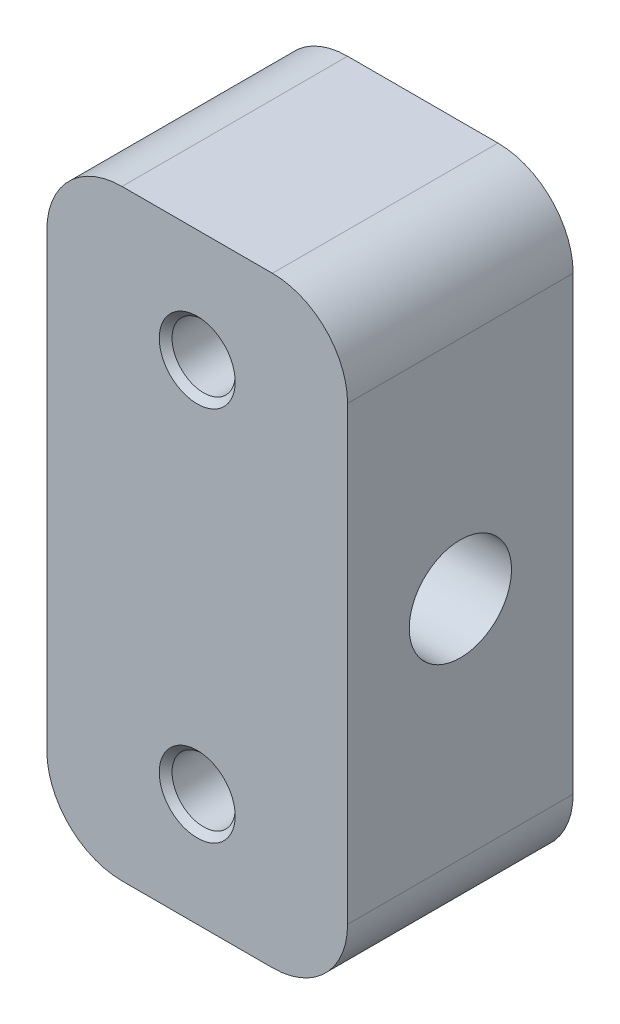
ISO-10303-21;
HEADER;
FILE_DESCRIPTION(('STEP AP214'),'2;1');
FILE_NAME('part.step','',(''),(''),'','','');
FILE_SCHEMA(('AUTOMOTIVE_DESIGN { 1 0 10303 214 1 1 1 1 }'));
ENDSEC;
DATA;
#1=APPLICATION_CONTEXT('core data for automotive mechanical design processes');
#2=APPLICATION_PROTOCOL_DEFINITION('international standard','automotive_design',2000,#1);
#3=PRODUCT_CONTEXT('',#1,'mechanical');
#4=PRODUCT('Part','Part','',(#3));
#5=PRODUCT_RELATED_PRODUCT_CATEGORY('part','',(#4));
#6=PRODUCT_DEFINITION_FORMATION('','',#4);
#7=PRODUCT_DEFINITION_CONTEXT('part definition',#1,'design');
#8=PRODUCT_DEFINITION('design','',#6,#7);
#9=PRODUCT_DEFINITION_SHAPE('','',#8);
#10=(LENGTH_UNIT() NAMED_UNIT(*) SI_UNIT(.MILLI.,.METRE.));
#11=(NAMED_UNIT(*) PLANE_ANGLE_UNIT() SI_UNIT($,.RADIAN.));
#12=(NAMED_UNIT(*) SI_UNIT($,.STERADIAN.) SOLID_ANGLE_UNIT());
#13=UNCERTAINTY_MEASURE_WITH_UNIT(LENGTH_MEASURE(1.E-05),#10,'distance_accuracy_value','');
#14=(GEOMETRIC_REPRESENTATION_CONTEXT(3) GLOBAL_UNCERTAINTY_ASSIGNED_CONTEXT((#13)) GLOBAL_UNIT_ASSIGNED_CONTEXT((#10,
#11,#12)) REPRESENTATION_CONTEXT('',''));
#15=CARTESIAN_POINT('',(0.,0.,0.));
#16=DIRECTION('',(0.,0.,1.));
#17=DIRECTION('',(1.,0.,0.));
#18=AXIS2_PLACEMENT_3D('',#15,#16,#17);
#19=CARTESIAN_POINT('',(10.,-20.,7.5));
#20=DIRECTION('',(-1.,0.,0.));
#21=DIRECTION('',(0.,0.,1.));
#22=AXIS2_PLACEMENT_3D('',#19,#20,#21);
#23=PLANE('',#22);
#24=CARTESIAN_POINT('',(10.,0.,0.));
#25=DIRECTION('',(-1.,0.,0.));
#26=DIRECTION('',(0.,0.,1.));
#27=AXIS2_PLACEMENT_3D('',#24,#25,#26);
#28=CIRCLE('',#27,3.4);
#29=CARTESIAN_POINT('',(10.,0.,3.4));
#30=VERTEX_POINT('',#29);
#31=EDGE_CURVE('E193',#30,#30,#28,.F.);
#32=ORIENTED_EDGE('',*,*,#31,.F.);
#33=EDGE_LOOP('',(#32));
#34=FACE_BOUND('',#33,.T.);
#35=DIRECTION('',(0.,1.,0.));
#36=VECTOR('',#35,1.);
#37=CARTESIAN_POINT('',(10.,-20.,7.5));
#38=LINE('',#37,#36);
#39=CARTESIAN_POINT('',(10.,-15.,7.5));
#40=VERTEX_POINT('',#39);
#41=CARTESIAN_POINT('',(10.,15.,7.5));
#42=VERTEX_POINT('',#41);
#43=EDGE_CURVE('E133',#40,#42,#38,.T.);
#44=ORIENTED_EDGE('',*,*,#43,.F.);
#45=DIRECTION('',(0.,0.,-1.));
#46=VECTOR('',#45,1.);
#47=CARTESIAN_POINT('',(10.,-15.,7.5));
#48=LINE('',#47,#46);
#49=CARTESIAN_POINT('',(10.,-15.,-7.5));
#50=VERTEX_POINT('',#49);
#51=EDGE_CURVE('E159',#40,#50,#48,.T.);
#52=ORIENTED_EDGE('',*,*,#51,.T.);
#53=DIRECTION('',(0.,1.,0.));
#54=VECTOR('',#53,1.);
#55=CARTESIAN_POINT('',(10.,-20.,-7.5));
#56=LINE('',#55,#54);
#57=CARTESIAN_POINT('',(10.,15.,-7.5));
#58=VERTEX_POINT('',#57);
#59=EDGE_CURVE('E167',#50,#58,#56,.T.);
#60=ORIENTED_EDGE('',*,*,#59,.T.);
#61=DIRECTION('',(0.,0.,-1.));
#62=VECTOR('',#61,1.);
#63=CARTESIAN_POINT('',(10.,15.,7.5));
#64=LINE('',#63,#62);
#65=EDGE_CURVE('E157',#58,#42,#64,.F.);
#66=ORIENTED_EDGE('',*,*,#65,.T.);
#67=EDGE_LOOP('',(#44,#52,#60,#66));
#68=FACE_BOUND('',#67,.T.);
#69=ADVANCED_FACE('F42',(#34,#68),#23,.F.);
#70=CARTESIAN_POINT('',(-10.,20.,7.5));
#71=DIRECTION('',(0.,-1.,0.));
#72=DIRECTION('',(0.,0.,-1.));
#73=AXIS2_PLACEMENT_3D('',#70,#71,#72);
#74=PLANE('',#73);
#75=DIRECTION('',(-1.,0.,0.));
#76=VECTOR('',#75,1.);
#77=CARTESIAN_POINT('',(-10.,20.,-7.5));
#78=LINE('',#77,#76);
#79=CARTESIAN_POINT('',(5.,20.,-7.5));
#80=VERTEX_POINT('',#79);
#81=CARTESIAN_POINT('',(-5.,20.,-7.5));
#82=VERTEX_POINT('',#81);
#83=EDGE_CURVE('E138',#80,#82,#78,.T.);
#84=ORIENTED_EDGE('',*,*,#83,.T.);
#85=DIRECTION('',(0.,0.,-1.));
#86=VECTOR('',#85,1.);
#87=CARTESIAN_POINT('',(-5.,20.,7.5));
#88=LINE('',#87,#86);
#89=CARTESIAN_POINT('',(-5.,20.,7.5));
#90=VERTEX_POINT('',#89);
#91=EDGE_CURVE('E11',#82,#90,#88,.F.);
#92=ORIENTED_EDGE('',*,*,#91,.T.);
#93=DIRECTION('',(-1.,0.,0.));
#94=VECTOR('',#93,1.);
#95=CARTESIAN_POINT('',(-10.,20.,7.5));
#96=LINE('',#95,#94);
#97=CARTESIAN_POINT('',(5.,20.,7.5));
#98=VERTEX_POINT('',#97);
#99=EDGE_CURVE('E136',#98,#90,#96,.T.);
#100=ORIENTED_EDGE('',*,*,#99,.F.);
#101=DIRECTION('',(0.,0.,-1.));
#102=VECTOR('',#101,1.);
#103=CARTESIAN_POINT('',(5.,20.,7.5));
#104=LINE('',#103,#102);
#105=EDGE_CURVE('E50',#98,#80,#104,.T.);
#106=ORIENTED_EDGE('',*,*,#105,.T.);
#107=EDGE_LOOP('',(#84,#92,#100,#106));
#108=FACE_BOUND('',#107,.T.);
#109=ADVANCED_FACE('F164',(#108),#74,.F.);
#110=CARTESIAN_POINT('',(-10.,-20.,7.5));
#111=DIRECTION('',(1.,0.,0.));
#112=DIRECTION('',(0.,0.,-1.));
#113=AXIS2_PLACEMENT_3D('',#110,#111,#112);
#114=PLANE('',#113);
#115=CARTESIAN_POINT('',(-10.,0.,0.));
#116=DIRECTION('',(-1.,0.,0.));
#117=DIRECTION('',(0.,0.,1.));
#118=AXIS2_PLACEMENT_3D('',#115,#116,#117);
#119=CIRCLE('',#118,4.025);
#120=CARTESIAN_POINT('',(-10.,0.,4.025));
#121=VERTEX_POINT('',#120);
#122=EDGE_CURVE('E197',#121,#121,#119,.T.);
#123=ORIENTED_EDGE('',*,*,#122,.F.);
#124=EDGE_LOOP('',(#123));
#125=FACE_BOUND('',#124,.T.);
#126=DIRECTION('',(0.,-1.,0.));
#127=VECTOR('',#126,1.);
#128=CARTESIAN_POINT('',(-10.,-20.,-7.5));
#129=LINE('',#128,#127);
#130=CARTESIAN_POINT('',(-10.,15.,-7.5));
#131=VERTEX_POINT('',#130);
#132=CARTESIAN_POINT('',(-10.,-15.,-7.5));
#133=VERTEX_POINT('',#132);
#134=EDGE_CURVE('E134',#131,#133,#129,.T.);
#135=ORIENTED_EDGE('',*,*,#134,.T.);
#136=DIRECTION('',(0.,0.,-1.));
#137=VECTOR('',#136,1.);
#138=CARTESIAN_POINT('',(-10.,-15.,7.5));
#139=LINE('',#138,#137);
#140=CARTESIAN_POINT('',(-10.,-15.,7.5));
#141=VERTEX_POINT('',#140);
#142=EDGE_CURVE('E112',#133,#141,#139,.F.);
#143=ORIENTED_EDGE('',*,*,#142,.T.);
#144=DIRECTION('',(0.,-1.,0.));
#145=VECTOR('',#144,1.);
#146=CARTESIAN_POINT('',(-10.,-20.,7.5));
#147=LINE('',#146,#145);
#148=CARTESIAN_POINT('',(-10.,15.,7.5));
#149=VERTEX_POINT('',#148);
#150=EDGE_CURVE('E172',#149,#141,#147,.T.);
#151=ORIENTED_EDGE('',*,*,#150,.F.);
#152=DIRECTION('',(0.,0.,-1.));
#153=VECTOR('',#152,1.);
#154=CARTESIAN_POINT('',(-10.,15.,7.5));
#155=LINE('',#154,#153);
#156=EDGE_CURVE('E117',#149,#131,#155,.T.);
#157=ORIENTED_EDGE('',*,*,#156,.T.);
#158=EDGE_LOOP('',(#135,#143,#151,#157));
#159=FACE_BOUND('',#158,.T.);
#160=ADVANCED_FACE('F220',(#125,#159),#114,.F.);
#161=CARTESIAN_POINT('',(-10.,-20.,7.5));
#162=DIRECTION('',(0.,1.,0.));
#163=DIRECTION('',(0.,0.,1.));
#164=AXIS2_PLACEMENT_3D('',#161,#162,#163);
#165=PLANE('',#164);
#166=DIRECTION('',(1.,0.,0.));
#167=VECTOR('',#166,1.);
#168=CARTESIAN_POINT('',(-10.,-20.,7.5));
#169=LINE('',#168,#167);
#170=CARTESIAN_POINT('',(-5.,-20.,7.5));
#171=VERTEX_POINT('',#170);
#172=CARTESIAN_POINT('',(5.,-20.,7.5));
#173=VERTEX_POINT('',#172);
#174=EDGE_CURVE('E127',#171,#173,#169,.T.);
#175=ORIENTED_EDGE('',*,*,#174,.F.);
#176=DIRECTION('',(0.,0.,-1.));
#177=VECTOR('',#176,1.);
#178=CARTESIAN_POINT('',(-5.,-20.,7.5));
#179=LINE('',#178,#177);
#180=CARTESIAN_POINT('',(-5.,-20.,-7.5));
#181=VERTEX_POINT('',#180);
#182=EDGE_CURVE('E111',#171,#181,#179,.T.);
#183=ORIENTED_EDGE('',*,*,#182,.T.);
#184=DIRECTION('',(1.,0.,0.));
#185=VECTOR('',#184,1.);
#186=CARTESIAN_POINT('',(-10.,-20.,-7.5));
#187=LINE('',#186,#185);
#188=CARTESIAN_POINT('',(5.,-20.,-7.5));
#189=VERTEX_POINT('',#188);
#190=EDGE_CURVE('E124',#181,#189,#187,.T.);
#191=ORIENTED_EDGE('',*,*,#190,.T.);
#192=DIRECTION('',(0.,0.,-1.));
#193=VECTOR('',#192,1.);
#194=CARTESIAN_POINT('',(5.,-20.,7.5));
#195=LINE('',#194,#193);
#196=EDGE_CURVE('E129',#189,#173,#195,.F.);
#197=ORIENTED_EDGE('',*,*,#196,.T.);
#198=EDGE_LOOP('',(#175,#183,#191,#197));
#199=FACE_BOUND('',#198,.T.);
#200=ADVANCED_FACE('F123',(#199),#165,.F.);
#201=CARTESIAN_POINT('',(0.,0.,7.5));
#202=DIRECTION('',(0.,0.,-1.));
#203=DIRECTION('',(-1.,0.,0.));
#204=AXIS2_PLACEMENT_3D('',#201,#202,#203);
#205=PLANE('',#204);
#206=CARTESIAN_POINT('',(0.,12.5,7.5));
#207=DIRECTION('',(0.,0.,1.));
#208=DIRECTION('',(1.,0.,0.));
#209=AXIS2_PLACEMENT_3D('',#206,#207,#208);
#210=CIRCLE('',#209,2.525);
#211=CARTESIAN_POINT('',(2.525,12.5,7.5));
#212=VERTEX_POINT('',#211);
#213=EDGE_CURVE('E190',#212,#212,#210,.T.);
#214=ORIENTED_EDGE('',*,*,#213,.F.);
#215=EDGE_LOOP('',(#214));
#216=FACE_BOUND('',#215,.T.);
#217=CARTESIAN_POINT('',(0.,-12.5,7.5));
#218=DIRECTION('',(0.,0.,1.));
#219=DIRECTION('',(1.,0.,0.));
#220=AXIS2_PLACEMENT_3D('',#217,#218,#219);
#221=CIRCLE('',#220,2.525);
#222=CARTESIAN_POINT('',(2.525,-12.5,7.5));
#223=VERTEX_POINT('',#222);
#224=EDGE_CURVE('E181',#223,#223,#221,.T.);
#225=ORIENTED_EDGE('',*,*,#224,.F.);
#226=EDGE_LOOP('',(#225));
#227=FACE_BOUND('',#226,.T.);
#228=ORIENTED_EDGE('',*,*,#150,.T.);
#229=CARTESIAN_POINT('',(-5.,-15.,7.5));
#230=DIRECTION('',(0.,0.,-1.));
#231=DIRECTION('',(-1.,0.,0.));
#232=AXIS2_PLACEMENT_3D('',#229,#230,#231);
#233=CIRCLE('',#232,5.);
#234=EDGE_CURVE('E155',#141,#171,#233,.F.);
#235=ORIENTED_EDGE('',*,*,#234,.T.);
#236=ORIENTED_EDGE('',*,*,#174,.T.);
#237=CARTESIAN_POINT('',(5.,-15.,7.5));
#238=DIRECTION('',(0.,0.,-1.));
#239=DIRECTION('',(-1.,0.,0.));
#240=AXIS2_PLACEMENT_3D('',#237,#238,#239);
#241=CIRCLE('',#240,5.);
#242=EDGE_CURVE('E153',#173,#40,#241,.F.);
#243=ORIENTED_EDGE('',*,*,#242,.T.);
#244=ORIENTED_EDGE('',*,*,#43,.T.);
#245=CARTESIAN_POINT('',(5.,15.,7.5));
#246=DIRECTION('',(0.,0.,-1.));
#247=DIRECTION('',(-1.,0.,0.));
#248=AXIS2_PLACEMENT_3D('',#245,#246,#247);
#249=CIRCLE('',#248,5.);
#250=EDGE_CURVE('E62',#42,#98,#249,.F.);
#251=ORIENTED_EDGE('',*,*,#250,.T.);
#252=ORIENTED_EDGE('',*,*,#99,.T.);
#253=CARTESIAN_POINT('',(-5.,15.,7.5));
#254=DIRECTION('',(0.,0.,-1.));
#255=DIRECTION('',(-1.,0.,0.));
#256=AXIS2_PLACEMENT_3D('',#253,#254,#255);
#257=CIRCLE('',#256,5.);
#258=EDGE_CURVE('E151',#90,#149,#257,.F.);
#259=ORIENTED_EDGE('',*,*,#258,.T.);
#260=EDGE_LOOP('',(#228,#235,#236,#243,#244,#251,#252,#259));
#261=FACE_BOUND('',#260,.T.);
#262=ADVANCED_FACE('F215',(#216,#227,#261),#205,.F.);
#263=CARTESIAN_POINT('',(0.,0.,-7.5));
#264=DIRECTION('',(0.,0.,-1.));
#265=DIRECTION('',(-1.,0.,0.));
#266=AXIS2_PLACEMENT_3D('',#263,#264,#265);
#267=PLANE('',#266);
#268=CARTESIAN_POINT('',(0.,12.5,-7.50000000000001));
#269=DIRECTION('',(0.,0.,1.));
#270=DIRECTION('',(1.,0.,0.));
#271=AXIS2_PLACEMENT_3D('',#268,#269,#270);
#272=CIRCLE('',#271,2.09999999999997);
#273=CARTESIAN_POINT('',(2.09999999999997,12.5,-7.50000000000001));
#274=VERTEX_POINT('',#273);
#275=EDGE_CURVE('E184',#274,#274,#272,.T.);
#276=ORIENTED_EDGE('',*,*,#275,.T.);
#277=EDGE_LOOP('',(#276));
#278=FACE_BOUND('',#277,.T.);
#279=CARTESIAN_POINT('',(0.,-12.5,-7.50000000000001));
#280=DIRECTION('',(0.,0.,1.));
#281=DIRECTION('',(1.,0.,0.));
#282=AXIS2_PLACEMENT_3D('',#279,#280,#281);
#283=CIRCLE('',#282,2.09999999999997);
#284=CARTESIAN_POINT('',(2.09999999999997,-12.5,-7.50000000000001));
#285=VERTEX_POINT('',#284);
#286=EDGE_CURVE('E168',#285,#285,#283,.T.);
#287=ORIENTED_EDGE('',*,*,#286,.T.);
#288=EDGE_LOOP('',(#287));
#289=FACE_BOUND('',#288,.T.);
#290=ORIENTED_EDGE('',*,*,#190,.F.);
#291=CARTESIAN_POINT('',(-5.,-15.,-7.5));
#292=DIRECTION('',(0.,0.,-1.));
#293=DIRECTION('',(-1.,0.,0.));
#294=AXIS2_PLACEMENT_3D('',#291,#292,#293);
#295=CIRCLE('',#294,5.);
#296=EDGE_CURVE('E107',#181,#133,#295,.T.);
#297=ORIENTED_EDGE('',*,*,#296,.T.);
#298=ORIENTED_EDGE('',*,*,#134,.F.);
#299=CARTESIAN_POINT('',(-5.,15.,-7.5));
#300=DIRECTION('',(0.,0.,-1.));
#301=DIRECTION('',(-1.,0.,0.));
#302=AXIS2_PLACEMENT_3D('',#299,#300,#301);
#303=CIRCLE('',#302,5.);
#304=EDGE_CURVE('E144',#131,#82,#303,.T.);
#305=ORIENTED_EDGE('',*,*,#304,.T.);
#306=ORIENTED_EDGE('',*,*,#83,.F.);
#307=CARTESIAN_POINT('',(5.,15.,-7.5));
#308=DIRECTION('',(0.,0.,-1.));
#309=DIRECTION('',(-1.,0.,0.));
#310=AXIS2_PLACEMENT_3D('',#307,#308,#309);
#311=CIRCLE('',#310,5.);
#312=EDGE_CURVE('E128',#80,#58,#311,.T.);
#313=ORIENTED_EDGE('',*,*,#312,.T.);
#314=ORIENTED_EDGE('',*,*,#59,.F.);
#315=CARTESIAN_POINT('',(5.,-15.,-7.5));
#316=DIRECTION('',(0.,0.,-1.));
#317=DIRECTION('',(-1.,0.,0.));
#318=AXIS2_PLACEMENT_3D('',#315,#316,#317);
#319=CIRCLE('',#318,5.);
#320=EDGE_CURVE('E118',#50,#189,#319,.T.);
#321=ORIENTED_EDGE('',*,*,#320,.T.);
#322=EDGE_LOOP('',(#290,#297,#298,#305,#306,#313,#314,#321));
#323=FACE_BOUND('',#322,.T.);
#324=ADVANCED_FACE('F131',(#278,#289,#323),#267,.T.);
#325=CARTESIAN_POINT('',(-5.,-15.,7.5));
#326=DIRECTION('',(0.,0.,-1.));
#327=DIRECTION('',(-1.,0.,0.));
#328=AXIS2_PLACEMENT_3D('',#325,#326,#327);
#329=CYLINDRICAL_SURFACE('',#328,5.);
#330=ORIENTED_EDGE('',*,*,#234,.F.);
#331=ORIENTED_EDGE('',*,*,#142,.F.);
#332=ORIENTED_EDGE('',*,*,#296,.F.);
#333=ORIENTED_EDGE('',*,*,#182,.F.);
#334=EDGE_LOOP('',(#330,#331,#332,#333));
#335=FACE_BOUND('',#334,.T.);
#336=ADVANCED_FACE('F110',(#335),#329,.T.);
#337=CARTESIAN_POINT('',(5.,-15.,7.5));
#338=DIRECTION('',(0.,0.,-1.));
#339=DIRECTION('',(-1.,0.,0.));
#340=AXIS2_PLACEMENT_3D('',#337,#338,#339);
#341=CYLINDRICAL_SURFACE('',#340,5.);
#342=ORIENTED_EDGE('',*,*,#242,.F.);
#343=ORIENTED_EDGE('',*,*,#196,.F.);
#344=ORIENTED_EDGE('',*,*,#320,.F.);
#345=ORIENTED_EDGE('',*,*,#51,.F.);
#346=EDGE_LOOP('',(#342,#343,#344,#345));
#347=FACE_BOUND('',#346,.T.);
#348=ADVANCED_FACE('F214',(#347),#341,.T.);
#349=CARTESIAN_POINT('',(-5.,15.,7.5));
#350=DIRECTION('',(0.,0.,-1.));
#351=DIRECTION('',(-1.,0.,0.));
#352=AXIS2_PLACEMENT_3D('',#349,#350,#351);
#353=CYLINDRICAL_SURFACE('',#352,5.);
#354=ORIENTED_EDGE('',*,*,#258,.F.);
#355=ORIENTED_EDGE('',*,*,#91,.F.);
#356=ORIENTED_EDGE('',*,*,#304,.F.);
#357=ORIENTED_EDGE('',*,*,#156,.F.);
#358=EDGE_LOOP('',(#354,#355,#356,#357));
#359=FACE_BOUND('',#358,.T.);
#360=ADVANCED_FACE('F222',(#359),#353,.T.);
#361=CARTESIAN_POINT('',(5.,15.,7.5));
#362=DIRECTION('',(0.,0.,-1.));
#363=DIRECTION('',(-1.,0.,0.));
#364=AXIS2_PLACEMENT_3D('',#361,#362,#363);
#365=CYLINDRICAL_SURFACE('',#364,5.);
#366=ORIENTED_EDGE('',*,*,#250,.F.);
#367=ORIENTED_EDGE('',*,*,#65,.F.);
#368=ORIENTED_EDGE('',*,*,#312,.F.);
#369=ORIENTED_EDGE('',*,*,#105,.F.);
#370=EDGE_LOOP('',(#366,#367,#368,#369));
#371=FACE_BOUND('',#370,.T.);
#372=ADVANCED_FACE('F44',(#371),#365,.T.);
#373=CARTESIAN_POINT('',(0.,-12.5,7.5));
#374=DIRECTION('',(0.,0.,1.));
#375=DIRECTION('',(1.,0.,0.));
#376=AXIS2_PLACEMENT_3D('',#373,#374,#375);
#377=CYLINDRICAL_SURFACE('',#376,2.09999999999998);
#378=ORIENTED_EDGE('',*,*,#286,.F.);
#379=EDGE_LOOP('',(#378));
#380=FACE_BOUND('',#379,.T.);
#381=CARTESIAN_POINT('',(0.,-12.5,7.07499999999996));
#382=DIRECTION('',(0.,0.,1.));
#383=DIRECTION('',(1.,0.,0.));
#384=AXIS2_PLACEMENT_3D('',#381,#382,#383);
#385=CIRCLE('',#384,2.09999999999998);
#386=CARTESIAN_POINT('',(2.09999999999998,-12.5,7.07499999999996));
#387=VERTEX_POINT('',#386);
#388=EDGE_CURVE('E178',#387,#387,#385,.T.);
#389=ORIENTED_EDGE('',*,*,#388,.T.);
#390=EDGE_LOOP('',(#389));
#391=FACE_BOUND('',#390,.T.);
#392=ADVANCED_FACE('F228',(#380,#391),#377,.F.);
#393=CARTESIAN_POINT('',(0.,-12.5,7.5));
#394=DIRECTION('',(0.,0.,1.));
#395=DIRECTION('',(1.,0.,0.));
#396=AXIS2_PLACEMENT_3D('',#393,#394,#395);
#397=CONICAL_SURFACE('',#396,2.525,0.785398163397434);
#398=ORIENTED_EDGE('',*,*,#388,.F.);
#399=EDGE_LOOP('',(#398));
#400=FACE_BOUND('',#399,.T.);
#401=ORIENTED_EDGE('',*,*,#224,.T.);
#402=EDGE_LOOP('',(#401));
#403=FACE_BOUND('',#402,.T.);
#404=ADVANCED_FACE('F248',(#400,#403),#397,.F.);
#405=CARTESIAN_POINT('',(0.,12.5,7.5));
#406=DIRECTION('',(0.,0.,1.));
#407=DIRECTION('',(1.,0.,0.));
#408=AXIS2_PLACEMENT_3D('',#405,#406,#407);
#409=CYLINDRICAL_SURFACE('',#408,2.09999999999998);
#410=ORIENTED_EDGE('',*,*,#275,.F.);
#411=EDGE_LOOP('',(#410));
#412=FACE_BOUND('',#411,.T.);
#413=CARTESIAN_POINT('',(0.,12.5,7.07499999999996));
#414=DIRECTION('',(0.,0.,1.));
#415=DIRECTION('',(1.,0.,0.));
#416=AXIS2_PLACEMENT_3D('',#413,#414,#415);
#417=CIRCLE('',#416,2.09999999999998);
#418=CARTESIAN_POINT('',(2.09999999999997,12.5,7.07499999999996));
#419=VERTEX_POINT('',#418);
#420=EDGE_CURVE('E187',#419,#419,#417,.T.);
#421=ORIENTED_EDGE('',*,*,#420,.T.);
#422=EDGE_LOOP('',(#421));
#423=FACE_BOUND('',#422,.T.);
#424=ADVANCED_FACE('F252',(#412,#423),#409,.F.);
#425=CARTESIAN_POINT('',(0.,12.5,7.5));
#426=DIRECTION('',(0.,0.,1.));
#427=DIRECTION('',(1.,0.,0.));
#428=AXIS2_PLACEMENT_3D('',#425,#426,#427);
#429=CONICAL_SURFACE('',#428,2.525,0.785398163397434);
#430=ORIENTED_EDGE('',*,*,#420,.F.);
#431=EDGE_LOOP('',(#430));
#432=FACE_BOUND('',#431,.T.);
#433=ORIENTED_EDGE('',*,*,#213,.T.);
#434=EDGE_LOOP('',(#433));
#435=FACE_BOUND('',#434,.T.);
#436=ADVANCED_FACE('F256',(#432,#435),#429,.F.);
#437=CARTESIAN_POINT('',(-10.,0.,0.));
#438=DIRECTION('',(-1.,0.,0.));
#439=DIRECTION('',(0.,0.,1.));
#440=AXIS2_PLACEMENT_3D('',#437,#438,#439);
#441=CYLINDRICAL_SURFACE('',#440,3.4);
#442=ORIENTED_EDGE('',*,*,#31,.T.);
#443=EDGE_LOOP('',(#442));
#444=FACE_BOUND('',#443,.T.);
#445=CARTESIAN_POINT('',(-9.375,0.,0.));
#446=DIRECTION('',(-1.,0.,0.));
#447=DIRECTION('',(0.,0.,1.));
#448=AXIS2_PLACEMENT_3D('',#445,#446,#447);
#449=CIRCLE('',#448,3.4);
#450=CARTESIAN_POINT('',(-9.375,0.,3.4));
#451=VERTEX_POINT('',#450);
#452=EDGE_CURVE('E194',#451,#451,#449,.T.);
#453=ORIENTED_EDGE('',*,*,#452,.T.);
#454=EDGE_LOOP('',(#453));
#455=FACE_BOUND('',#454,.T.);
#456=ADVANCED_FACE('F203',(#444,#455),#441,.F.);
#457=CARTESIAN_POINT('',(-10.,0.,0.));
#458=DIRECTION('',(-1.,0.,0.));
#459=DIRECTION('',(0.,0.,1.));
#460=AXIS2_PLACEMENT_3D('',#457,#458,#459);
#461=CONICAL_SURFACE('',#460,4.025,0.785398163397447);
#462=ORIENTED_EDGE('',*,*,#452,.F.);
#463=EDGE_LOOP('',(#462));
#464=FACE_BOUND('',#463,.T.);
#465=ORIENTED_EDGE('',*,*,#122,.T.);
#466=EDGE_LOOP('',(#465));
#467=FACE_BOUND('',#466,.T.);
#468=ADVANCED_FACE('F263',(#464,#467),#461,.F.);
#469=CLOSED_SHELL('',(#69,#109,#160,#200,#262,#324,#336,#348,#360,#372,#392,#404,#424,#436,#456,#468));
#470=MANIFOLD_SOLID_BREP('B2',#469);
#471=ADVANCED_BREP_SHAPE_REPRESENTATION('',(#18,#470),#14);
#472=SHAPE_DEFINITION_REPRESENTATION(#9,#471);
ENDSEC;
END-ISO-10303-21;
